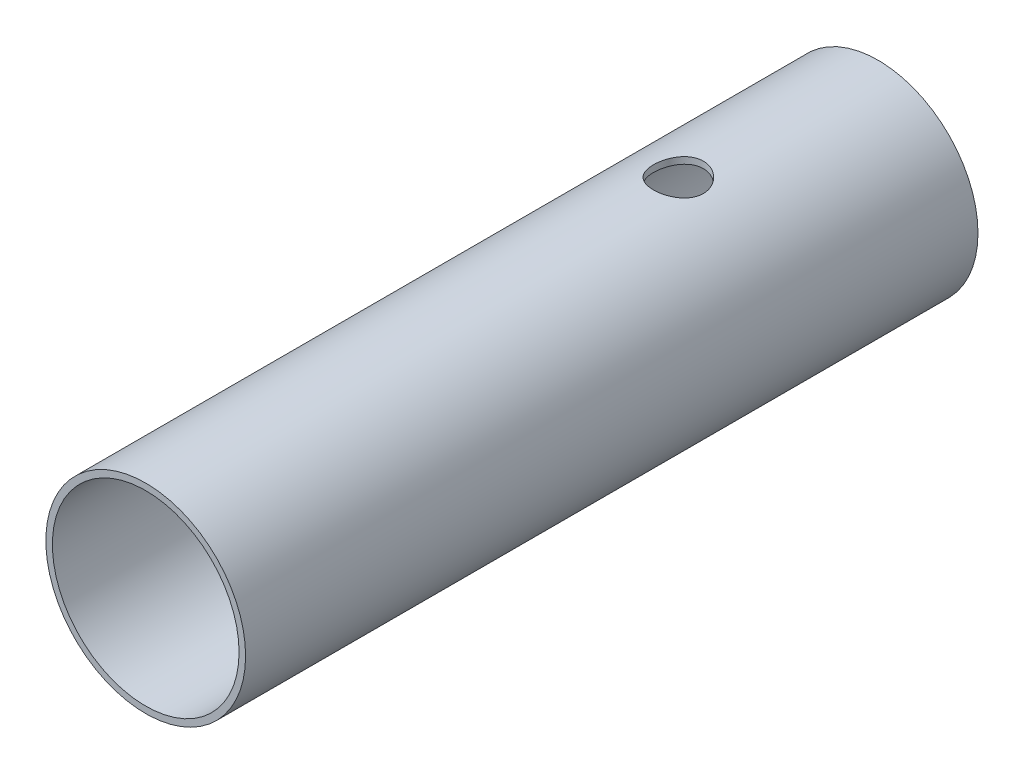
ISO-10303-21;
HEADER;
FILE_DESCRIPTION(('STEP AP214'),'2;1');
FILE_NAME('part.step','',(''),(''),'','','');
FILE_SCHEMA(('AUTOMOTIVE_DESIGN { 1 0 10303 214 1 1 1 1 }'));
ENDSEC;
DATA;
#1=APPLICATION_CONTEXT('core data for automotive mechanical design processes');
#2=APPLICATION_PROTOCOL_DEFINITION('international standard','automotive_design',2000,#1);
#3=PRODUCT_CONTEXT('',#1,'mechanical');
#4=PRODUCT('Part','Part','',(#3));
#5=PRODUCT_RELATED_PRODUCT_CATEGORY('part','',(#4));
#6=PRODUCT_DEFINITION_FORMATION('','',#4);
#7=PRODUCT_DEFINITION_CONTEXT('part definition',#1,'design');
#8=PRODUCT_DEFINITION('design','',#6,#7);
#9=PRODUCT_DEFINITION_SHAPE('','',#8);
#10=(LENGTH_UNIT() NAMED_UNIT(*) SI_UNIT(.MILLI.,.METRE.));
#11=(NAMED_UNIT(*) PLANE_ANGLE_UNIT() SI_UNIT($,.RADIAN.));
#12=(NAMED_UNIT(*) SI_UNIT($,.STERADIAN.) SOLID_ANGLE_UNIT());
#13=UNCERTAINTY_MEASURE_WITH_UNIT(LENGTH_MEASURE(1.E-05),#10,'distance_accuracy_value','');
#14=(GEOMETRIC_REPRESENTATION_CONTEXT(3) GLOBAL_UNCERTAINTY_ASSIGNED_CONTEXT((#13)) GLOBAL_UNIT_ASSIGNED_CONTEXT((#10,
#11,#12)) REPRESENTATION_CONTEXT('',''));
#15=CARTESIAN_POINT('',(0.,0.,0.));
#16=DIRECTION('',(0.,0.,1.));
#17=DIRECTION('',(1.,0.,0.));
#18=AXIS2_PLACEMENT_3D('',#15,#16,#17);
#19=CARTESIAN_POINT('',(0.,0.,69.85));
#20=DIRECTION('',(0.,0.,1.));
#21=DIRECTION('',(1.,0.,0.));
#22=AXIS2_PLACEMENT_3D('',#19,#20,#21);
#23=PLANE('',#22);
#24=CARTESIAN_POINT('',(0.,0.,69.85));
#25=DIRECTION('',(0.,0.,1.));
#26=DIRECTION('',(1.,0.,0.));
#27=AXIS2_PLACEMENT_3D('',#24,#25,#26);
#28=CIRCLE('',#27,19.05);
#29=CARTESIAN_POINT('',(19.05,0.,69.85));
#30=VERTEX_POINT('',#29);
#31=EDGE_CURVE('E10',#30,#30,#28,.T.);
#32=ORIENTED_EDGE('',*,*,#31,.T.);
#33=EDGE_LOOP('',(#32));
#34=FACE_BOUND('',#33,.T.);
#35=CARTESIAN_POINT('',(0.,0.,69.85));
#36=DIRECTION('',(0.,0.,1.));
#37=DIRECTION('',(1.,0.,0.));
#38=AXIS2_PLACEMENT_3D('',#35,#36,#37);
#39=CIRCLE('',#38,17.8054);
#40=CARTESIAN_POINT('',(17.8054,0.,69.85));
#41=VERTEX_POINT('',#40);
#42=EDGE_CURVE('E56',#41,#41,#39,.T.);
#43=ORIENTED_EDGE('',*,*,#42,.F.);
#44=EDGE_LOOP('',(#43));
#45=FACE_BOUND('',#44,.T.);
#46=ADVANCED_FACE('F37',(#34,#45),#23,.T.);
#47=CARTESIAN_POINT('',(0.,0.,-69.85));
#48=DIRECTION('',(0.,0.,1.));
#49=DIRECTION('',(1.,0.,0.));
#50=AXIS2_PLACEMENT_3D('',#47,#48,#49);
#51=PLANE('',#50);
#52=CARTESIAN_POINT('',(0.,0.,-69.85));
#53=DIRECTION('',(0.,0.,1.));
#54=DIRECTION('',(1.,0.,0.));
#55=AXIS2_PLACEMENT_3D('',#52,#53,#54);
#56=CIRCLE('',#55,19.05);
#57=CARTESIAN_POINT('',(19.05,0.,-69.85));
#58=VERTEX_POINT('',#57);
#59=EDGE_CURVE('E51',#58,#58,#56,.T.);
#60=ORIENTED_EDGE('',*,*,#59,.F.);
#61=EDGE_LOOP('',(#60));
#62=FACE_BOUND('',#61,.T.);
#63=CARTESIAN_POINT('',(0.,0.,-69.85));
#64=DIRECTION('',(0.,0.,1.));
#65=DIRECTION('',(1.,0.,0.));
#66=AXIS2_PLACEMENT_3D('',#63,#64,#65);
#67=CIRCLE('',#66,17.8054);
#68=CARTESIAN_POINT('',(17.8054,0.,-69.85));
#69=VERTEX_POINT('',#68);
#70=EDGE_CURVE('E59',#69,#69,#67,.T.);
#71=ORIENTED_EDGE('',*,*,#70,.T.);
#72=EDGE_LOOP('',(#71));
#73=FACE_BOUND('',#72,.T.);
#74=ADVANCED_FACE('F95',(#62,#73),#51,.F.);
#75=CARTESIAN_POINT('',(0.,0.,69.85));
#76=DIRECTION('',(0.,0.,-1.));
#77=DIRECTION('',(-1.,0.,0.));
#78=AXIS2_PLACEMENT_3D('',#75,#76,#77);
#79=CYLINDRICAL_SURFACE('',#78,19.05);
#80=CARTESIAN_POINT('',(0.,19.05,-26.9875));
#81=CARTESIAN_POINT('',(-0.263131581526396,19.0499955508094,-26.9875073842187));
#82=CARTESIAN_POINT('',(-0.526345651112673,19.0444938556855,-27.0093806737068));
#83=CARTESIAN_POINT('',(-1.04523007797144,19.0230796140991,-27.0961648553997));
#84=CARTESIAN_POINT('',(-1.3008960738146,19.0071611670842,-27.1611001402827));
#85=CARTESIAN_POINT('',(-1.79711626917968,18.966676136042,-27.3317946297421));
#86=CARTESIAN_POINT('',(-2.03768821389026,18.9421199402354,-27.437504810921));
#87=CARTESIAN_POINT('',(-2.49768401879656,18.886974665892,-27.6865759133924));
#88=CARTESIAN_POINT('',(-2.71710716530732,18.8563853838695,-27.8299381046777));
#89=CARTESIAN_POINT('',(-3.13309611918041,18.7917903815363,-28.153362507152));
#90=CARTESIAN_POINT('',(-3.32916431594385,18.757731951953,-28.334054250495));
#91=CARTESIAN_POINT('',(-3.68855284387054,18.6903874387445,-28.7256607505862));
#92=CARTESIAN_POINT('',(-3.85186947731368,18.6571014427033,-28.9365789153565));
#93=CARTESIAN_POINT('',(-4.14345927338674,18.5945391284168,-29.3865148448899));
#94=CARTESIAN_POINT('',(-4.27117578556232,18.5653297242577,-29.6259035078177));
#95=CARTESIAN_POINT('',(-4.48436018464861,18.514996460472,-30.1236012070206));
#96=CARTESIAN_POINT('',(-4.56983482602245,18.4938713082978,-30.3819072108291));
#97=CARTESIAN_POINT('',(-4.69441160685513,18.4626401351083,-30.9046356067903));
#98=CARTESIAN_POINT('',(-4.73440845195427,18.4523218391551,-31.1688317949206));
#99=CARTESIAN_POINT('',(-4.76968113583585,18.443237258092,-31.7003702065729));
#100=CARTESIAN_POINT('',(-4.7649642502725,18.4444690935867,-31.9677119111975));
#101=CARTESIAN_POINT('',(-4.71165721573106,18.4581547751589,-32.4910951895915));
#102=CARTESIAN_POINT('',(-4.66413323010526,18.4703359004816,-32.7472535981524));
#103=CARTESIAN_POINT('',(-4.528261793417,18.5041130320564,-33.2478413366426));
#104=CARTESIAN_POINT('',(-4.43991143407032,18.5257097090233,-33.4922698296168));
#105=CARTESIAN_POINT('',(-4.22398659245056,18.5761348665047,-33.9653182016005));
#106=CARTESIAN_POINT('',(-4.09602516846452,18.6050341471667,-34.1937535954319));
#107=CARTESIAN_POINT('',(-3.80478117634746,18.6667683193602,-34.6262919034779));
#108=CARTESIAN_POINT('',(-3.64149242746806,18.6996038991244,-34.8303905501135));
#109=CARTESIAN_POINT('',(-3.27870637336287,18.7666592071416,-35.2145714798297));
#110=CARTESIAN_POINT('',(-3.07830936967661,18.8008917059265,-35.3938030059448));
#111=CARTESIAN_POINT('',(-2.64989283807425,18.8660394071255,-35.7162774448229));
#112=CARTESIAN_POINT('',(-2.42187246672272,18.8969545081937,-35.8595192582868));
#113=CARTESIAN_POINT('',(-1.94346794656342,18.9521379939905,-36.1062606112624));
#114=CARTESIAN_POINT('',(-1.69300967343738,18.9763831840553,-36.2096219553078));
#115=CARTESIAN_POINT('',(-1.17753132585365,19.0153263644775,-36.3725374456279));
#116=CARTESIAN_POINT('',(-0.912514047302788,19.0300261810222,-36.4320999716276));
#117=CARTESIAN_POINT('',(-0.382714405988335,19.0479521018661,-36.5044277706493));
#118=CARTESIAN_POINT('',(-0.118099585962567,19.0514621988878,-36.5183516077891));
#119=CARTESIAN_POINT('',(0.40967937749479,19.0474220528589,-36.5021844184738));
#120=CARTESIAN_POINT('',(0.672843649371594,19.0398728054288,-36.4720973541127));
#121=CARTESIAN_POINT('',(1.18622530336536,19.0147442007934,-36.3697173658574));
#122=CARTESIAN_POINT('',(1.43657675272578,18.9973151353987,-36.2980564884606));
#123=CARTESIAN_POINT('',(1.92169190353674,18.9543914356345,-36.1152850082096));
#124=CARTESIAN_POINT('',(2.15645402792867,18.928895986747,-36.0041704213055));
#125=CARTESIAN_POINT('',(2.60833595181471,18.8719875266574,-35.7434002908229));
#126=CARTESIAN_POINT('',(2.82506877782855,18.8404775388889,-35.5930958431409));
#127=CARTESIAN_POINT('',(3.23064699831752,18.7751881667117,-35.259042039569));
#128=CARTESIAN_POINT('',(3.41948756974008,18.7414083912834,-35.075286911714));
#129=CARTESIAN_POINT('',(3.76869505363012,18.6743643834617,-34.6741687743212));
#130=CARTESIAN_POINT('',(3.92824927969694,18.6411331577848,-34.4560915429762));
#131=CARTESIAN_POINT('',(4.20849665986831,18.5798738886387,-33.9955738855624));
#132=CARTESIAN_POINT('',(4.32919153896266,18.5518456142307,-33.7531345415695));
#133=CARTESIAN_POINT('',(4.5273957604281,18.5044745072254,-33.2520743313596));
#134=CARTESIAN_POINT('',(4.60516095934264,18.4850803532866,-32.993559780106));
#135=CARTESIAN_POINT('',(4.71597247031956,18.4571241228829,-32.4665668998119));
#136=CARTESIAN_POINT('',(4.7490285622388,18.4485596775091,-32.1980907630159));
#137=CARTESIAN_POINT('',(4.76897252431611,18.4434131133217,-31.6670657492194));
#138=CARTESIAN_POINT('',(4.75715932544307,18.4464938626329,-31.4045681434188));
#139=CARTESIAN_POINT('',(4.69067285863095,18.4635111092241,-30.8854351534356));
#140=CARTESIAN_POINT('',(4.63600045202906,18.4774473883417,-30.6287996515496));
#141=CARTESIAN_POINT('',(4.48605693923535,18.5144175271476,-30.1300881424845));
#142=CARTESIAN_POINT('',(4.39102945986139,18.5373967338792,-29.8879345558669));
#143=CARTESIAN_POINT('',(4.1632661006949,18.5898712441369,-29.4228349098794));
#144=CARTESIAN_POINT('',(4.03052499085822,18.6193674513003,-29.1998915201303));
#145=CARTESIAN_POINT('',(3.72703010192324,18.6825138879017,-28.7732640529199));
#146=CARTESIAN_POINT('',(3.5553750422465,18.7162524084177,-28.5702340918793));
#147=CARTESIAN_POINT('',(3.18068125352732,18.7835548650601,-28.1954381327742));
#148=CARTESIAN_POINT('',(2.97763508250411,18.8171187578316,-28.0236795693912));
#149=CARTESIAN_POINT('',(2.54148458778075,18.8810155668159,-27.7132690953075));
#150=CARTESIAN_POINT('',(2.30790249085453,18.911278959367,-27.5752731015928));
#151=CARTESIAN_POINT('',(1.82011973894575,18.9644313679593,-27.3407268051638));
#152=CARTESIAN_POINT('',(1.56593401391164,18.9873256650929,-27.2441468049409));
#153=CARTESIAN_POINT('',(1.09350255404802,19.0197758912061,-27.1095094387034));
#154=CARTESIAN_POINT('',(0.877507042633117,19.031032075423,-27.0638548033053));
#155=CARTESIAN_POINT('',(0.441026777127698,19.0461457161143,-27.0028481290003));
#156=CARTESIAN_POINT('',(0.220542361945306,19.0500037290659,-26.9874938109557));
#157=CARTESIAN_POINT('',(0.,19.05,-26.9875));
#158=B_SPLINE_CURVE_WITH_KNOTS('',3,(#80,#81,#82,#83,#84,#85,#86,#87,#88,#89,#90,#91,#92,#93,
#94,#95,#96,#97,#98,#99,#100,#101,#102,#103,#104,#105,#106,#107,#108,#109,#110,#111,#112,#113,
#114,#115,#116,#117,#118,#119,#120,#121,#122,#123,#124,#125,#126,#127,#128,#129,#130,#131,#132,
#133,#134,#135,#136,#137,#138,#139,#140,#141,#142,#143,#144,#145,#146,#147,#148,#149,#150,#151,
#152,#153,#154,#155,#156,#157),.UNSPECIFIED.,.T.,.F.,(4,2,2,2,2,2,2,2,2,2,2,2,2,2,2,2,2,2,2,2,2,
2,2,2,2,2,2,2,2,2,2,2,2,2,2,2,2,2,4),(0.,0.78858653709825,1.57762015490038,2.36570806475838,
3.15382256003762,3.95650832512916,4.75928466416697,5.57398705957936,6.38855914212745,
7.18681236945896,7.98493571018356,8.76371428007824,9.54254833515215,10.3292442601011,
11.1160779341536,11.9253476558718,12.7346420935798,13.5467162711448,14.3586350397198,
15.149776309245,15.940846360435,16.7201937159261,17.4996197925882,18.2928764053054,
19.08627002561,19.8991381673475,20.7119702204023,21.5199040841399,22.3276611884506,
23.1122150278763,23.8967531006066,24.6766207180149,25.4565965385991,26.2569190512671,
27.0574315904632,27.8724418898644,28.6868668015804,29.3478662136657,30.008815904619),.UNSPECIFIED.);
#159=CARTESIAN_POINT('',(0.,19.05,-26.9875));
#160=VERTEX_POINT('',#159);
#161=EDGE_CURVE('E79',#160,#160,#158,.T.);
#162=ORIENTED_EDGE('',*,*,#161,.T.);
#163=EDGE_LOOP('',(#162));
#164=FACE_BOUND('',#163,.T.);
#165=CARTESIAN_POINT('',(0.,-19.05,-26.9875));
#166=CARTESIAN_POINT('',(0.263131581526396,-19.0499955508094,-26.9875073842187));
#167=CARTESIAN_POINT('',(0.526345651112673,-19.0444938556855,-27.0093806737068));
#168=CARTESIAN_POINT('',(1.04523007797144,-19.0230796140991,-27.0961648553997));
#169=CARTESIAN_POINT('',(1.3008960738146,-19.0071611670842,-27.1611001402827));
#170=CARTESIAN_POINT('',(1.79711626917968,-18.966676136042,-27.3317946297421));
#171=CARTESIAN_POINT('',(2.03768821389026,-18.9421199402354,-27.437504810921));
#172=CARTESIAN_POINT('',(2.49768401879656,-18.886974665892,-27.6865759133924));
#173=CARTESIAN_POINT('',(2.71710716530732,-18.8563853838695,-27.8299381046777));
#174=CARTESIAN_POINT('',(3.13309611918041,-18.7917903815363,-28.153362507152));
#175=CARTESIAN_POINT('',(3.32916431594385,-18.757731951953,-28.334054250495));
#176=CARTESIAN_POINT('',(3.68855284387054,-18.6903874387445,-28.7256607505862));
#177=CARTESIAN_POINT('',(3.85186947731368,-18.6571014427033,-28.9365789153565));
#178=CARTESIAN_POINT('',(4.14345927338674,-18.5945391284168,-29.3865148448899));
#179=CARTESIAN_POINT('',(4.27117578556232,-18.5653297242577,-29.6259035078177));
#180=CARTESIAN_POINT('',(4.48436018464861,-18.514996460472,-30.1236012070206));
#181=CARTESIAN_POINT('',(4.56983482602245,-18.4938713082978,-30.3819072108291));
#182=CARTESIAN_POINT('',(4.69441160685513,-18.4626401351083,-30.9046356067903));
#183=CARTESIAN_POINT('',(4.73440845195427,-18.4523218391551,-31.1688317949206));
#184=CARTESIAN_POINT('',(4.76968113583585,-18.443237258092,-31.7003702065729));
#185=CARTESIAN_POINT('',(4.7649642502725,-18.4444690935867,-31.9677119111975));
#186=CARTESIAN_POINT('',(4.71165721573106,-18.4581547751589,-32.4910951895915));
#187=CARTESIAN_POINT('',(4.66413323010526,-18.4703359004816,-32.7472535981524));
#188=CARTESIAN_POINT('',(4.528261793417,-18.5041130320564,-33.2478413366426));
#189=CARTESIAN_POINT('',(4.43991143407032,-18.5257097090233,-33.4922698296168));
#190=CARTESIAN_POINT('',(4.22398659245056,-18.5761348665047,-33.9653182016005));
#191=CARTESIAN_POINT('',(4.09602516846452,-18.6050341471667,-34.1937535954319));
#192=CARTESIAN_POINT('',(3.80478117634746,-18.6667683193602,-34.6262919034779));
#193=CARTESIAN_POINT('',(3.64149242746806,-18.6996038991244,-34.8303905501135));
#194=CARTESIAN_POINT('',(3.27870637336287,-18.7666592071416,-35.2145714798297));
#195=CARTESIAN_POINT('',(3.07830936967661,-18.8008917059265,-35.3938030059448));
#196=CARTESIAN_POINT('',(2.64989283807425,-18.8660394071255,-35.7162774448229));
#197=CARTESIAN_POINT('',(2.42187246672272,-18.8969545081937,-35.8595192582868));
#198=CARTESIAN_POINT('',(1.94346794656342,-18.9521379939905,-36.1062606112624));
#199=CARTESIAN_POINT('',(1.69300967343738,-18.9763831840553,-36.2096219553078));
#200=CARTESIAN_POINT('',(1.17753132585365,-19.0153263644775,-36.3725374456279));
#201=CARTESIAN_POINT('',(0.912514047302788,-19.0300261810222,-36.4320999716276));
#202=CARTESIAN_POINT('',(0.382714405988335,-19.0479521018661,-36.5044277706493));
#203=CARTESIAN_POINT('',(0.118099585962567,-19.0514621988878,-36.5183516077891));
#204=CARTESIAN_POINT('',(-0.40967937749479,-19.0474220528589,-36.5021844184738));
#205=CARTESIAN_POINT('',(-0.672843649371594,-19.0398728054288,-36.4720973541127));
#206=CARTESIAN_POINT('',(-1.18622530336536,-19.0147442007934,-36.3697173658574));
#207=CARTESIAN_POINT('',(-1.43657675272578,-18.9973151353987,-36.2980564884606));
#208=CARTESIAN_POINT('',(-1.92169190353674,-18.9543914356345,-36.1152850082096));
#209=CARTESIAN_POINT('',(-2.15645402792867,-18.928895986747,-36.0041704213055));
#210=CARTESIAN_POINT('',(-2.60833595181471,-18.8719875266574,-35.7434002908229));
#211=CARTESIAN_POINT('',(-2.82506877782855,-18.8404775388889,-35.5930958431409));
#212=CARTESIAN_POINT('',(-3.23064699831752,-18.7751881667117,-35.259042039569));
#213=CARTESIAN_POINT('',(-3.41948756974008,-18.7414083912834,-35.075286911714));
#214=CARTESIAN_POINT('',(-3.76869505363012,-18.6743643834617,-34.6741687743212));
#215=CARTESIAN_POINT('',(-3.92824927969694,-18.6411331577848,-34.4560915429762));
#216=CARTESIAN_POINT('',(-4.20849665986831,-18.5798738886387,-33.9955738855624));
#217=CARTESIAN_POINT('',(-4.32919153896266,-18.5518456142307,-33.7531345415695));
#218=CARTESIAN_POINT('',(-4.5273957604281,-18.5044745072254,-33.2520743313596));
#219=CARTESIAN_POINT('',(-4.60516095934264,-18.4850803532866,-32.993559780106));
#220=CARTESIAN_POINT('',(-4.71597247031956,-18.4571241228829,-32.4665668998119));
#221=CARTESIAN_POINT('',(-4.7490285622388,-18.4485596775091,-32.1980907630159));
#222=CARTESIAN_POINT('',(-4.76897252431611,-18.4434131133217,-31.6670657492194));
#223=CARTESIAN_POINT('',(-4.75715932544307,-18.4464938626329,-31.4045681434188));
#224=CARTESIAN_POINT('',(-4.69067285863095,-18.4635111092241,-30.8854351534356));
#225=CARTESIAN_POINT('',(-4.63600045202906,-18.4774473883417,-30.6287996515496));
#226=CARTESIAN_POINT('',(-4.48605693923535,-18.5144175271476,-30.1300881424845));
#227=CARTESIAN_POINT('',(-4.39102945986139,-18.5373967338792,-29.8879345558669));
#228=CARTESIAN_POINT('',(-4.1632661006949,-18.5898712441369,-29.4228349098794));
#229=CARTESIAN_POINT('',(-4.03052499085822,-18.6193674513003,-29.1998915201303));
#230=CARTESIAN_POINT('',(-3.72703010192324,-18.6825138879017,-28.7732640529199));
#231=CARTESIAN_POINT('',(-3.5553750422465,-18.7162524084177,-28.5702340918793));
#232=CARTESIAN_POINT('',(-3.18068125352732,-18.7835548650601,-28.1954381327742));
#233=CARTESIAN_POINT('',(-2.97763508250411,-18.8171187578316,-28.0236795693912));
#234=CARTESIAN_POINT('',(-2.54148458778075,-18.8810155668159,-27.7132690953075));
#235=CARTESIAN_POINT('',(-2.30790249085453,-18.911278959367,-27.5752731015928));
#236=CARTESIAN_POINT('',(-1.82011973894575,-18.9644313679593,-27.3407268051638));
#237=CARTESIAN_POINT('',(-1.56593401391164,-18.9873256650929,-27.2441468049409));
#238=CARTESIAN_POINT('',(-1.09350255404802,-19.0197758912061,-27.1095094387034));
#239=CARTESIAN_POINT('',(-0.877507042633117,-19.031032075423,-27.0638548033053));
#240=CARTESIAN_POINT('',(-0.441026777127698,-19.0461457161143,-27.0028481290003));
#241=CARTESIAN_POINT('',(-0.220542361945306,-19.0500037290659,-26.9874938109557));
#242=CARTESIAN_POINT('',(0.,-19.05,-26.9875));
#243=B_SPLINE_CURVE_WITH_KNOTS('',3,(#165,#166,#167,#168,#169,#170,#171,#172,#173,#174,#175,
#176,#177,#178,#179,#180,#181,#182,#183,#184,#185,#186,#187,#188,#189,#190,#191,#192,#193,#194,
#195,#196,#197,#198,#199,#200,#201,#202,#203,#204,#205,#206,#207,#208,#209,#210,#211,#212,#213,
#214,#215,#216,#217,#218,#219,#220,#221,#222,#223,#224,#225,#226,#227,#228,#229,#230,#231,#232,
#233,#234,#235,#236,#237,#238,#239,#240,#241,#242),.UNSPECIFIED.,.T.,.F.,(4,2,2,2,2,2,2,2,2,2,2,
2,2,2,2,2,2,2,2,2,2,2,2,2,2,2,2,2,2,2,2,2,2,2,2,2,2,2,4),(0.,0.78858653709825,1.57762015490038,
2.36570806475838,3.15382256003762,3.95650832512916,4.75928466416697,5.57398705957936,
6.38855914212745,7.18681236945896,7.98493571018356,8.76371428007824,9.54254833515215,
10.3292442601011,11.1160779341536,11.9253476558718,12.7346420935798,13.5467162711448,
14.3586350397198,15.149776309245,15.940846360435,16.7201937159261,17.4996197925882,
18.2928764053054,19.08627002561,19.8991381673475,20.7119702204023,21.5199040841399,
22.3276611884506,23.1122150278763,23.8967531006066,24.6766207180149,25.4565965385991,
26.2569190512671,27.0574315904632,27.8724418898644,28.6868668015804,29.3478662136657,
30.008815904619),.UNSPECIFIED.);
#244=CARTESIAN_POINT('',(0.,-19.05,-26.9875));
#245=VERTEX_POINT('',#244);
#246=EDGE_CURVE('E84',#245,#245,#243,.T.);
#247=ORIENTED_EDGE('',*,*,#246,.T.);
#248=EDGE_LOOP('',(#247));
#249=FACE_BOUND('',#248,.T.);
#250=ORIENTED_EDGE('',*,*,#31,.F.);
#251=EDGE_LOOP('',(#250));
#252=FACE_BOUND('',#251,.T.);
#253=ORIENTED_EDGE('',*,*,#59,.T.);
#254=EDGE_LOOP('',(#253));
#255=FACE_BOUND('',#254,.T.);
#256=ADVANCED_FACE('F39',(#164,#249,#252,#255),#79,.T.);
#257=CARTESIAN_POINT('',(0.,0.,69.85));
#258=DIRECTION('',(0.,0.,-1.));
#259=DIRECTION('',(-1.,0.,0.));
#260=AXIS2_PLACEMENT_3D('',#257,#258,#259);
#261=CYLINDRICAL_SURFACE('',#260,17.8054);
#262=CARTESIAN_POINT('',(0.,-17.8054,-26.9875));
#263=CARTESIAN_POINT('',(0.262514275143203,-17.8053960719839,-26.9875061698834));
#264=CARTESIAN_POINT('',(0.525094551460252,-17.7995373281067,-27.0092778659266));
#265=CARTESIAN_POINT('',(1.04268901817383,-17.7767347002025,-27.0956340697705));
#266=CARTESIAN_POINT('',(1.29769953906195,-17.7597855288465,-27.1602389983844));
#267=CARTESIAN_POINT('',(1.79260854955932,-17.7166724757801,-27.3300095609911));
#268=CARTESIAN_POINT('',(2.03252612409429,-17.6905205187112,-27.4351227225511));
#269=CARTESIAN_POINT('',(2.49132714042283,-17.6317646323805,-27.6827309744379));
#270=CARTESIAN_POINT('',(2.71020914530543,-17.599160262828,-27.825228615971));
#271=CARTESIAN_POINT('',(3.12582897376477,-17.5301687518291,-28.1470683037256));
#272=CARTESIAN_POINT('',(3.3220064884537,-17.4937166467279,-28.3271200135285));
#273=CARTESIAN_POINT('',(3.68177236379677,-17.4215544886963,-28.7174398936489));
#274=CARTESIAN_POINT('',(3.84535650198139,-17.3858445324474,-28.9277119729472));
#275=CARTESIAN_POINT('',(4.13802900556349,-17.318544839354,-29.3769823372686));
#276=CARTESIAN_POINT('',(4.26647187798601,-17.2870370375297,-29.6164145235061));
#277=CARTESIAN_POINT('',(4.48105785373418,-17.2326645880685,-30.1144544618286));
#278=CARTESIAN_POINT('',(4.56720880939785,-17.2097983361371,-30.3730586439793));
#279=CARTESIAN_POINT('',(4.69281778848236,-17.1759688409317,-30.8958943540156));
#280=CARTESIAN_POINT('',(4.73329208696424,-17.1647469946319,-31.1598645852212));
#281=CARTESIAN_POINT('',(4.76956733854533,-17.154704332097,-31.6910685851373));
#282=CARTESIAN_POINT('',(4.7653766937673,-17.1558811834867,-31.9583017305991));
#283=CARTESIAN_POINT('',(4.71324763838602,-17.1702715425962,-32.480505983036));
#284=CARTESIAN_POINT('',(4.66653993572086,-17.1831464174866,-32.7356107627285));
#285=CARTESIAN_POINT('',(4.53267415888853,-17.2189398081199,-33.2342242608657));
#286=CARTESIAN_POINT('',(4.4455128343298,-17.2418591309119,-33.4777320457743));
#287=CARTESIAN_POINT('',(4.23221338954307,-17.295456113386,-33.9494426872109));
#288=CARTESIAN_POINT('',(4.10564456252061,-17.326218789339,-34.1774407177004));
#289=CARTESIAN_POINT('',(3.81742338612086,-17.3919907111135,-34.6093938070627));
#290=CARTESIAN_POINT('',(3.65576409285381,-17.4270007968295,-34.8133440948945));
#291=CARTESIAN_POINT('',(3.2956623461795,-17.4987315134903,-35.1984426790041));
#292=CARTESIAN_POINT('',(3.0961866834612,-17.5354705706889,-35.3786227656306));
#293=CARTESIAN_POINT('',(2.66940154526232,-17.6054894193446,-35.7031723632861));
#294=CARTESIAN_POINT('',(2.44209096014632,-17.6387690727951,-35.8475404459798));
#295=CARTESIAN_POINT('',(1.96458315552289,-17.6983261716685,-36.0967978609881));
#296=CARTESIAN_POINT('',(1.71428983233766,-17.7245722318026,-36.2015110757018));
#297=CARTESIAN_POINT('',(1.19878941353439,-17.7668780908417,-36.3670937962752));
#298=CARTESIAN_POINT('',(0.933585611096725,-17.7829401294785,-36.4279729427883));
#299=CARTESIAN_POINT('',(0.404054547038425,-17.8027291185037,-36.502637074824));
#300=CARTESIAN_POINT('',(0.139925478812329,-17.8068007312863,-36.5177383222229));
#301=CARTESIAN_POINT('',(-0.387091572962794,-17.8031414978991,-36.5040542571663));
#302=CARTESIAN_POINT('',(-0.649979682773093,-17.7954118795916,-36.4752735104251));
#303=CARTESIAN_POINT('',(-1.16234825663305,-17.7692413848121,-36.3757217482449));
#304=CARTESIAN_POINT('',(-1.41198198558054,-17.750988107176,-36.3056857025686));
#305=CARTESIAN_POINT('',(-1.89593248398272,-17.7058416795328,-36.1264655985802));
#306=CARTESIAN_POINT('',(-2.13024758521792,-17.6789475904094,-36.0172772849011));
#307=CARTESIAN_POINT('',(-2.582017765525,-17.6186961501299,-35.7604159994452));
#308=CARTESIAN_POINT('',(-2.79905035709975,-17.5852220323252,-35.6120280283325));
#309=CARTESIAN_POINT('',(-3.20559632982966,-17.5156795920416,-35.281877784938));
#310=CARTESIAN_POINT('',(-3.39510422763829,-17.4796107547884,-35.1001088789425));
#311=CARTESIAN_POINT('',(-3.74677376847098,-17.4076746655983,-34.7022127522541));
#312=CARTESIAN_POINT('',(-3.90800651222839,-17.3718421958965,-34.4852567312277));
#313=CARTESIAN_POINT('',(-4.19179734441118,-17.3055604483371,-34.0266094366941));
#314=CARTESIAN_POINT('',(-4.31435703843478,-17.2751109470168,-33.7849191906355));
#315=CARTESIAN_POINT('',(-4.51640078647421,-17.2233932582878,-33.2848628717338));
#316=CARTESIAN_POINT('',(-4.59613356116076,-17.2020722067544,-33.0266030559259));
#317=CARTESIAN_POINT('',(-4.71084379112385,-17.1710168189474,-32.4996737229915));
#318=CARTESIAN_POINT('',(-4.7458327685106,-17.1612794997569,-32.2310069041716));
#319=CARTESIAN_POINT('',(-4.76939652011706,-17.1547443032548,-31.7004031827482));
#320=CARTESIAN_POINT('',(-4.75946474021774,-17.1575300617104,-31.4385367411861));
#321=CARTESIAN_POINT('',(-4.69693548991127,-17.1747517052905,-30.9203586677565));
#322=CARTESIAN_POINT('',(-4.6443391301018,-17.1891872871596,-30.6640468914742));
#323=CARTESIAN_POINT('',(-4.49884198049609,-17.2278334613183,-30.1661463829984));
#324=CARTESIAN_POINT('',(-4.4062594615595,-17.2519667609381,-29.9244582235542));
#325=CARTESIAN_POINT('',(-4.18366521780074,-17.3072906194565,-29.459862122838));
#326=CARTESIAN_POINT('',(-4.05364758920432,-17.3384822913428,-29.236957150977));
#327=CARTESIAN_POINT('',(-3.75535527092156,-17.4055613277714,-28.8091307634666));
#328=CARTESIAN_POINT('',(-3.58606232805153,-17.4415603335838,-28.6049367170872));
#329=CARTESIAN_POINT('',(-3.21595912844577,-17.5135763520931,-28.2273703451275));
#330=CARTESIAN_POINT('',(-3.01514120879688,-17.5495933670402,-28.0540055352532));
#331=CARTESIAN_POINT('',(-2.58246394842137,-17.6185159404866,-27.7393432000825));
#332=CARTESIAN_POINT('',(-2.35002866466364,-17.6513376663739,-27.5988176964395));
#333=CARTESIAN_POINT('',(-1.86396307534231,-17.7092526925833,-27.3590573499518));
#334=CARTESIAN_POINT('',(-1.61034641197797,-17.7343509192808,-27.2597961727302));
#335=CARTESIAN_POINT('',(-1.13141576602114,-17.7707693218145,-27.1182372762545));
#336=CARTESIAN_POINT('',(-0.908154038416099,-17.7836609055223,-27.0693250891879));
#337=CARTESIAN_POINT('',(-0.456611181334642,-17.8009775293263,-27.0039553914213));
#338=CARTESIAN_POINT('',(-0.228330556375192,-17.8054034165232,-26.9874946335378));
#339=CARTESIAN_POINT('',(0.,-17.8054,-26.9875));
#340=B_SPLINE_CURVE_WITH_KNOTS('',3,(#262,#263,#264,#265,#266,#267,#268,#269,#270,#271,#272,
#273,#274,#275,#276,#277,#278,#279,#280,#281,#282,#283,#284,#285,#286,#287,#288,#289,#290,#291,
#292,#293,#294,#295,#296,#297,#298,#299,#300,#301,#302,#303,#304,#305,#306,#307,#308,#309,#310,
#311,#312,#313,#314,#315,#316,#317,#318,#319,#320,#321,#322,#323,#324,#325,#326,#327,#328,#329,
#330,#331,#332,#333,#334,#335,#336,#337,#338,#339),.UNSPECIFIED.,.T.,.F.,(4,2,2,2,2,2,2,2,2,2,2,
2,2,2,2,2,2,2,2,2,2,2,2,2,2,2,2,2,2,2,2,2,2,2,2,2,2,2,4),(0.,0.786705447332299,1.57378622772158,
2.35985086969614,3.145969168563,3.94856468907439,4.75126411826731,5.56784539016493,
6.38427499006181,7.18215754953973,7.9798900184011,8.75524090610259,9.5306541029444,
10.3148587773244,11.0992187760355,11.9093249971553,12.7194635235705,13.5331590275523,
14.3466755165599,15.1365677082242,15.9263777209431,16.702525410875,17.4787574840367,
18.2702637645651,19.0619275097984,19.8760623759872,20.6901634370961,21.4994839712871,
22.3085960529107,23.0910096340849,23.8734028489778,24.6496801492978,25.4260799410064,
26.2254550800687,27.0250248284514,27.8418346191569,28.6581223288477,29.342454140102,
30.0267174716667),.UNSPECIFIED.);
#341=CARTESIAN_POINT('',(0.,-17.8054,-26.9875));
#342=VERTEX_POINT('',#341);
#343=EDGE_CURVE('E42',#342,#342,#340,.T.);
#344=ORIENTED_EDGE('',*,*,#343,.F.);
#345=EDGE_LOOP('',(#344));
#346=FACE_BOUND('',#345,.T.);
#347=CARTESIAN_POINT('',(0.,17.8054,-26.9875));
#348=CARTESIAN_POINT('',(-0.262514275143203,17.8053960719839,-26.9875061698834));
#349=CARTESIAN_POINT('',(-0.525094551460252,17.7995373281067,-27.0092778659266));
#350=CARTESIAN_POINT('',(-1.04268901817383,17.7767347002025,-27.0956340697705));
#351=CARTESIAN_POINT('',(-1.29769953906195,17.7597855288465,-27.1602389983844));
#352=CARTESIAN_POINT('',(-1.79260854955932,17.7166724757801,-27.3300095609911));
#353=CARTESIAN_POINT('',(-2.03252612409429,17.6905205187112,-27.4351227225511));
#354=CARTESIAN_POINT('',(-2.49132714042283,17.6317646323805,-27.6827309744379));
#355=CARTESIAN_POINT('',(-2.71020914530543,17.599160262828,-27.825228615971));
#356=CARTESIAN_POINT('',(-3.12582897376477,17.5301687518291,-28.1470683037256));
#357=CARTESIAN_POINT('',(-3.3220064884537,17.4937166467279,-28.3271200135285));
#358=CARTESIAN_POINT('',(-3.68177236379677,17.4215544886963,-28.7174398936489));
#359=CARTESIAN_POINT('',(-3.84535650198139,17.3858445324474,-28.9277119729472));
#360=CARTESIAN_POINT('',(-4.13802900556349,17.318544839354,-29.3769823372686));
#361=CARTESIAN_POINT('',(-4.26647187798601,17.2870370375297,-29.6164145235061));
#362=CARTESIAN_POINT('',(-4.48105785373418,17.2326645880685,-30.1144544618286));
#363=CARTESIAN_POINT('',(-4.56720880939785,17.2097983361371,-30.3730586439793));
#364=CARTESIAN_POINT('',(-4.69281778848236,17.1759688409317,-30.8958943540156));
#365=CARTESIAN_POINT('',(-4.73329208696424,17.1647469946319,-31.1598645852212));
#366=CARTESIAN_POINT('',(-4.76956733854533,17.154704332097,-31.6910685851373));
#367=CARTESIAN_POINT('',(-4.7653766937673,17.1558811834867,-31.9583017305991));
#368=CARTESIAN_POINT('',(-4.71324763838602,17.1702715425962,-32.480505983036));
#369=CARTESIAN_POINT('',(-4.66653993572086,17.1831464174866,-32.7356107627285));
#370=CARTESIAN_POINT('',(-4.53267415888853,17.2189398081199,-33.2342242608657));
#371=CARTESIAN_POINT('',(-4.4455128343298,17.2418591309119,-33.4777320457743));
#372=CARTESIAN_POINT('',(-4.23221338954307,17.295456113386,-33.9494426872109));
#373=CARTESIAN_POINT('',(-4.10564456252061,17.326218789339,-34.1774407177004));
#374=CARTESIAN_POINT('',(-3.81742338612086,17.3919907111135,-34.6093938070627));
#375=CARTESIAN_POINT('',(-3.65576409285381,17.4270007968295,-34.8133440948945));
#376=CARTESIAN_POINT('',(-3.2956623461795,17.4987315134903,-35.1984426790041));
#377=CARTESIAN_POINT('',(-3.0961866834612,17.5354705706889,-35.3786227656306));
#378=CARTESIAN_POINT('',(-2.66940154526232,17.6054894193446,-35.7031723632861));
#379=CARTESIAN_POINT('',(-2.44209096014632,17.6387690727951,-35.8475404459798));
#380=CARTESIAN_POINT('',(-1.96458315552289,17.6983261716685,-36.0967978609881));
#381=CARTESIAN_POINT('',(-1.71428983233766,17.7245722318026,-36.2015110757018));
#382=CARTESIAN_POINT('',(-1.19878941353439,17.7668780908417,-36.3670937962752));
#383=CARTESIAN_POINT('',(-0.933585611096725,17.7829401294785,-36.4279729427883));
#384=CARTESIAN_POINT('',(-0.404054547038425,17.8027291185037,-36.502637074824));
#385=CARTESIAN_POINT('',(-0.139925478812329,17.8068007312863,-36.5177383222229));
#386=CARTESIAN_POINT('',(0.387091572962794,17.8031414978991,-36.5040542571663));
#387=CARTESIAN_POINT('',(0.649979682773093,17.7954118795916,-36.4752735104251));
#388=CARTESIAN_POINT('',(1.16234825663305,17.7692413848121,-36.3757217482449));
#389=CARTESIAN_POINT('',(1.41198198558054,17.750988107176,-36.3056857025686));
#390=CARTESIAN_POINT('',(1.89593248398272,17.7058416795328,-36.1264655985802));
#391=CARTESIAN_POINT('',(2.13024758521792,17.6789475904094,-36.0172772849011));
#392=CARTESIAN_POINT('',(2.582017765525,17.6186961501299,-35.7604159994452));
#393=CARTESIAN_POINT('',(2.79905035709975,17.5852220323252,-35.6120280283325));
#394=CARTESIAN_POINT('',(3.20559632982966,17.5156795920416,-35.281877784938));
#395=CARTESIAN_POINT('',(3.39510422763829,17.4796107547884,-35.1001088789425));
#396=CARTESIAN_POINT('',(3.74677376847098,17.4076746655983,-34.7022127522541));
#397=CARTESIAN_POINT('',(3.90800651222839,17.3718421958965,-34.4852567312277));
#398=CARTESIAN_POINT('',(4.19179734441118,17.3055604483371,-34.0266094366941));
#399=CARTESIAN_POINT('',(4.31435703843478,17.2751109470168,-33.7849191906355));
#400=CARTESIAN_POINT('',(4.51640078647421,17.2233932582878,-33.2848628717338));
#401=CARTESIAN_POINT('',(4.59613356116076,17.2020722067544,-33.0266030559259));
#402=CARTESIAN_POINT('',(4.71084379112385,17.1710168189474,-32.4996737229915));
#403=CARTESIAN_POINT('',(4.7458327685106,17.1612794997569,-32.2310069041716));
#404=CARTESIAN_POINT('',(4.76939652011706,17.1547443032548,-31.7004031827482));
#405=CARTESIAN_POINT('',(4.75946474021774,17.1575300617104,-31.4385367411861));
#406=CARTESIAN_POINT('',(4.69693548991127,17.1747517052905,-30.9203586677565));
#407=CARTESIAN_POINT('',(4.6443391301018,17.1891872871596,-30.6640468914742));
#408=CARTESIAN_POINT('',(4.49884198049609,17.2278334613183,-30.1661463829984));
#409=CARTESIAN_POINT('',(4.4062594615595,17.2519667609381,-29.9244582235542));
#410=CARTESIAN_POINT('',(4.18366521780074,17.3072906194565,-29.459862122838));
#411=CARTESIAN_POINT('',(4.05364758920432,17.3384822913428,-29.236957150977));
#412=CARTESIAN_POINT('',(3.75535527092156,17.4055613277714,-28.8091307634666));
#413=CARTESIAN_POINT('',(3.58606232805153,17.4415603335838,-28.6049367170872));
#414=CARTESIAN_POINT('',(3.21595912844577,17.5135763520931,-28.2273703451275));
#415=CARTESIAN_POINT('',(3.01514120879688,17.5495933670402,-28.0540055352532));
#416=CARTESIAN_POINT('',(2.58246394842137,17.6185159404866,-27.7393432000825));
#417=CARTESIAN_POINT('',(2.35002866466364,17.6513376663739,-27.5988176964395));
#418=CARTESIAN_POINT('',(1.86396307534231,17.7092526925833,-27.3590573499518));
#419=CARTESIAN_POINT('',(1.61034641197797,17.7343509192808,-27.2597961727302));
#420=CARTESIAN_POINT('',(1.13141576602114,17.7707693218145,-27.1182372762545));
#421=CARTESIAN_POINT('',(0.908154038416099,17.7836609055223,-27.0693250891879));
#422=CARTESIAN_POINT('',(0.456611181334642,17.8009775293263,-27.0039553914213));
#423=CARTESIAN_POINT('',(0.228330556375192,17.8054034165232,-26.9874946335378));
#424=CARTESIAN_POINT('',(0.,17.8054,-26.9875));
#425=B_SPLINE_CURVE_WITH_KNOTS('',3,(#347,#348,#349,#350,#351,#352,#353,#354,#355,#356,#357,
#358,#359,#360,#361,#362,#363,#364,#365,#366,#367,#368,#369,#370,#371,#372,#373,#374,#375,#376,
#377,#378,#379,#380,#381,#382,#383,#384,#385,#386,#387,#388,#389,#390,#391,#392,#393,#394,#395,
#396,#397,#398,#399,#400,#401,#402,#403,#404,#405,#406,#407,#408,#409,#410,#411,#412,#413,#414,
#415,#416,#417,#418,#419,#420,#421,#422,#423,#424),.UNSPECIFIED.,.T.,.F.,(4,2,2,2,2,2,2,2,2,2,2,
2,2,2,2,2,2,2,2,2,2,2,2,2,2,2,2,2,2,2,2,2,2,2,2,2,2,2,4),(0.,0.786705447332299,1.57378622772158,
2.35985086969614,3.145969168563,3.94856468907439,4.75126411826731,5.56784539016493,
6.38427499006181,7.18215754953973,7.9798900184011,8.75524090610259,9.5306541029444,
10.3148587773244,11.0992187760355,11.9093249971553,12.7194635235705,13.5331590275523,
14.3466755165599,15.1365677082242,15.9263777209431,16.702525410875,17.4787574840367,
18.2702637645651,19.0619275097984,19.8760623759872,20.6901634370961,21.4994839712871,
22.3085960529107,23.0910096340849,23.8734028489778,24.6496801492978,25.4260799410064,
26.2254550800687,27.0250248284514,27.8418346191569,28.6581223288477,29.342454140102,
30.0267174716667),.UNSPECIFIED.);
#426=CARTESIAN_POINT('',(0.,17.8054,-26.9875));
#427=VERTEX_POINT('',#426);
#428=EDGE_CURVE('E61',#427,#427,#425,.T.);
#429=ORIENTED_EDGE('',*,*,#428,.F.);
#430=EDGE_LOOP('',(#429));
#431=FACE_BOUND('',#430,.T.);
#432=ORIENTED_EDGE('',*,*,#42,.T.);
#433=EDGE_LOOP('',(#432));
#434=FACE_BOUND('',#433,.T.);
#435=ORIENTED_EDGE('',*,*,#70,.F.);
#436=EDGE_LOOP('',(#435));
#437=FACE_BOUND('',#436,.T.);
#438=ADVANCED_FACE('F66',(#346,#431,#434,#437),#261,.F.);
#439=CARTESIAN_POINT('',(0.,-19.05,-31.75));
#440=DIRECTION('',(0.,1.,0.));
#441=DIRECTION('',(0.,0.,1.));
#442=AXIS2_PLACEMENT_3D('',#439,#440,#441);
#443=CYLINDRICAL_SURFACE('',#442,4.7625);
#444=ORIENTED_EDGE('',*,*,#428,.T.);
#445=EDGE_LOOP('',(#444));
#446=FACE_BOUND('',#445,.T.);
#447=ORIENTED_EDGE('',*,*,#161,.F.);
#448=EDGE_LOOP('',(#447));
#449=FACE_BOUND('',#448,.T.);
#450=ADVANCED_FACE('F72',(#446,#449),#443,.F.);
#451=ORIENTED_EDGE('',*,*,#343,.T.);
#452=EDGE_LOOP('',(#451));
#453=FACE_BOUND('',#452,.T.);
#454=ORIENTED_EDGE('',*,*,#246,.F.);
#455=EDGE_LOOP('',(#454));
#456=FACE_BOUND('',#455,.T.);
#457=ADVANCED_FACE('F69',(#453,#456),#443,.F.);
#458=CLOSED_SHELL('',(#46,#74,#256,#438,#450,#457));
#459=MANIFOLD_SOLID_BREP('B2',#458);
#460=ADVANCED_BREP_SHAPE_REPRESENTATION('',(#18,#459),#14);
#461=SHAPE_DEFINITION_REPRESENTATION(#9,#460);
ENDSEC;
END-ISO-10303-21;
